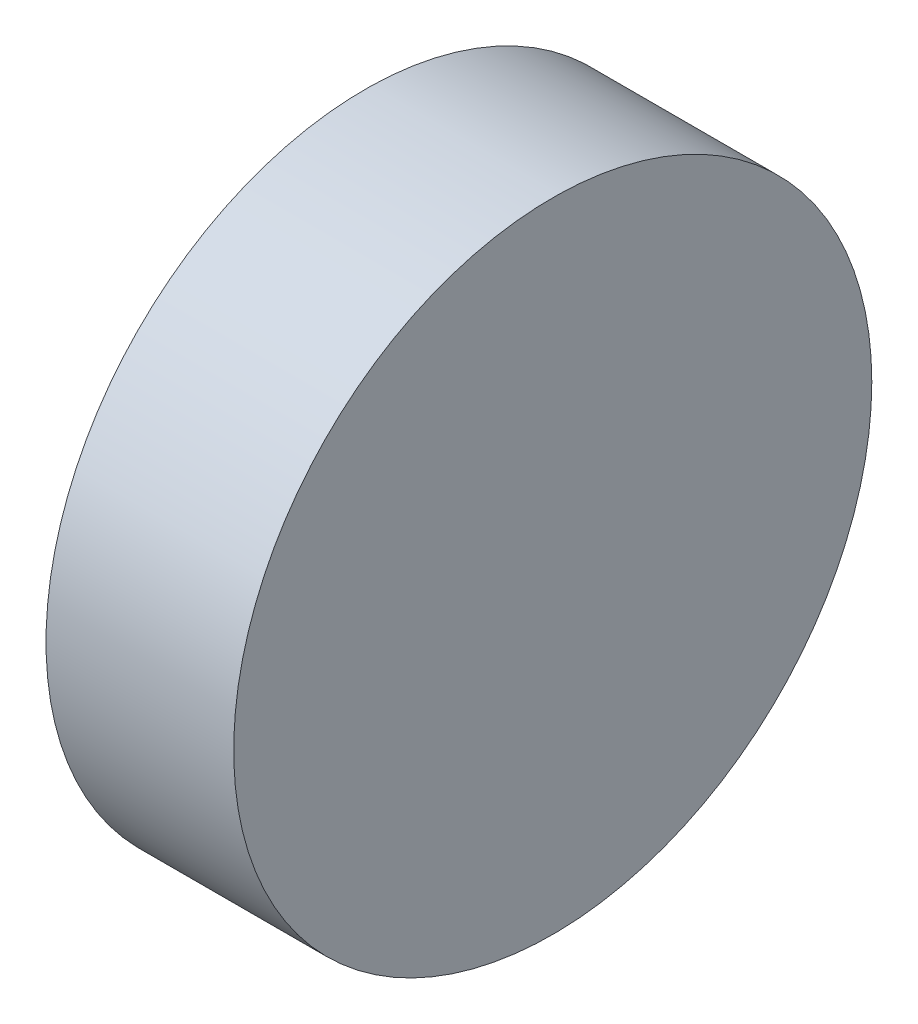
ISO-10303-21;
HEADER;
FILE_DESCRIPTION(('STEP AP214'),'2;1');
FILE_NAME('part.step','',(''),(''),'','','');
FILE_SCHEMA(('AUTOMOTIVE_DESIGN { 1 0 10303 214 1 1 1 1 }'));
ENDSEC;
DATA;
#1=APPLICATION_CONTEXT('core data for automotive mechanical design processes');
#2=APPLICATION_PROTOCOL_DEFINITION('international standard','automotive_design',2000,#1);
#3=PRODUCT_CONTEXT('',#1,'mechanical');
#4=PRODUCT('Part','Part','',(#3));
#5=PRODUCT_RELATED_PRODUCT_CATEGORY('part','',(#4));
#6=PRODUCT_DEFINITION_FORMATION('','',#4);
#7=PRODUCT_DEFINITION_CONTEXT('part definition',#1,'design');
#8=PRODUCT_DEFINITION('design','',#6,#7);
#9=PRODUCT_DEFINITION_SHAPE('','',#8);
#10=(LENGTH_UNIT() NAMED_UNIT(*) SI_UNIT(.MILLI.,.METRE.));
#11=(NAMED_UNIT(*) PLANE_ANGLE_UNIT() SI_UNIT($,.RADIAN.));
#12=(NAMED_UNIT(*) SI_UNIT($,.STERADIAN.) SOLID_ANGLE_UNIT());
#13=UNCERTAINTY_MEASURE_WITH_UNIT(LENGTH_MEASURE(1.E-05),#10,'distance_accuracy_value','');
#14=(GEOMETRIC_REPRESENTATION_CONTEXT(3) GLOBAL_UNCERTAINTY_ASSIGNED_CONTEXT((#13)) GLOBAL_UNIT_ASSIGNED_CONTEXT((#10,
#11,#12)) REPRESENTATION_CONTEXT('',''));
#15=CARTESIAN_POINT('',(0.,0.,0.));
#16=DIRECTION('',(0.,0.,1.));
#17=DIRECTION('',(1.,0.,0.));
#18=AXIS2_PLACEMENT_3D('',#15,#16,#17);
#19=CARTESIAN_POINT('',(1.80000000596,0.,0.75));
#20=DIRECTION('',(1.,0.,0.));
#21=DIRECTION('',(0.,0.,-1.));
#22=AXIS2_PLACEMENT_3D('',#19,#20,#21);
#23=PLANE('',#22);
#24=CARTESIAN_POINT('',(1.80000000596,0.,0.75));
#25=DIRECTION('',(1.,0.,0.));
#26=DIRECTION('',(0.,0.,-1.));
#27=AXIS2_PLACEMENT_3D('',#24,#25,#26);
#28=CIRCLE('',#27,0.680000007153);
#29=CARTESIAN_POINT('',(1.80000000596,0.,0.0699999928470001));
#30=VERTEX_POINT('',#29);
#31=EDGE_CURVE('E18',#30,#30,#28,.F.);
#32=ORIENTED_EDGE('',*,*,#31,.F.);
#33=EDGE_LOOP('',(#32));
#34=FACE_BOUND('',#33,.T.);
#35=ADVANCED_FACE('F15',(#34),#23,.T.);
#36=CARTESIAN_POINT('',(1.4,0.,0.75));
#37=DIRECTION('',(1.,0.,0.));
#38=DIRECTION('',(0.,0.,-1.));
#39=AXIS2_PLACEMENT_3D('',#36,#37,#38);
#40=CYLINDRICAL_SURFACE('',#39,0.680000007153);
#41=ORIENTED_EDGE('',*,*,#31,.T.);
#42=EDGE_LOOP('',(#41));
#43=FACE_BOUND('',#42,.T.);
#44=CARTESIAN_POINT('',(1.4,0.,0.75));
#45=DIRECTION('',(1.,0.,0.));
#46=DIRECTION('',(0.,0.,-1.));
#47=AXIS2_PLACEMENT_3D('',#44,#45,#46);
#48=CIRCLE('',#47,0.680000007153);
#49=CARTESIAN_POINT('',(1.4,0.,0.069999992847));
#50=VERTEX_POINT('',#49);
#51=EDGE_CURVE('E10',#50,#50,#48,.T.);
#52=ORIENTED_EDGE('',*,*,#51,.T.);
#53=EDGE_LOOP('',(#52));
#54=FACE_BOUND('',#53,.T.);
#55=ADVANCED_FACE('F27',(#43,#54),#40,.T.);
#56=CARTESIAN_POINT('',(1.4,0.,0.75));
#57=DIRECTION('',(1.,0.,0.));
#58=DIRECTION('',(0.,0.,-1.));
#59=AXIS2_PLACEMENT_3D('',#56,#57,#58);
#60=PLANE('',#59);
#61=ORIENTED_EDGE('',*,*,#51,.F.);
#62=EDGE_LOOP('',(#61));
#63=FACE_BOUND('',#62,.T.);
#64=ADVANCED_FACE('F34',(#63),#60,.F.);
#65=CLOSED_SHELL('',(#35,#55,#64));
#66=MANIFOLD_SOLID_BREP('B1',#65);
#67=ADVANCED_BREP_SHAPE_REPRESENTATION('',(#18,#66),#14);
#68=SHAPE_DEFINITION_REPRESENTATION(#9,#67);
ENDSEC;
END-ISO-10303-21;
